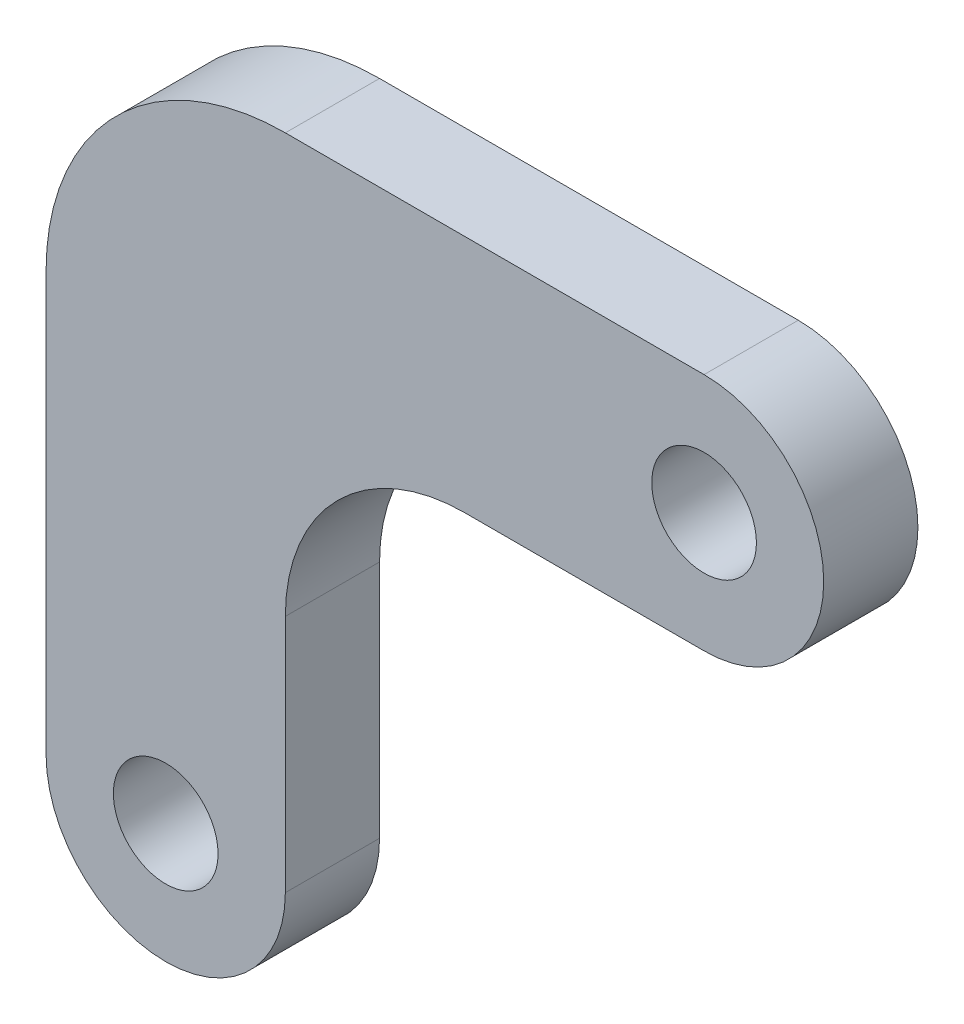
ISO-10303-21;
HEADER;
FILE_DESCRIPTION(('STEP AP214'),'2;1');
FILE_NAME('part.step','',(''),(''),'','','');
FILE_SCHEMA(('AUTOMOTIVE_DESIGN { 1 0 10303 214 1 1 1 1 }'));
ENDSEC;
DATA;
#1=APPLICATION_CONTEXT('core data for automotive mechanical design processes');
#2=APPLICATION_PROTOCOL_DEFINITION('international standard','automotive_design',2000,#1);
#3=PRODUCT_CONTEXT('',#1,'mechanical');
#4=PRODUCT('Part','Part','',(#3));
#5=PRODUCT_RELATED_PRODUCT_CATEGORY('part','',(#4));
#6=PRODUCT_DEFINITION_FORMATION('','',#4);
#7=PRODUCT_DEFINITION_CONTEXT('part definition',#1,'design');
#8=PRODUCT_DEFINITION('design','',#6,#7);
#9=PRODUCT_DEFINITION_SHAPE('','',#8);
#10=(LENGTH_UNIT() NAMED_UNIT(*) SI_UNIT(.MILLI.,.METRE.));
#11=(NAMED_UNIT(*) PLANE_ANGLE_UNIT() SI_UNIT($,.RADIAN.));
#12=(NAMED_UNIT(*) SI_UNIT($,.STERADIAN.) SOLID_ANGLE_UNIT());
#13=UNCERTAINTY_MEASURE_WITH_UNIT(LENGTH_MEASURE(1.E-05),#10,'distance_accuracy_value','');
#14=(GEOMETRIC_REPRESENTATION_CONTEXT(3) GLOBAL_UNCERTAINTY_ASSIGNED_CONTEXT((#13)) GLOBAL_UNIT_ASSIGNED_CONTEXT((#10,
#11,#12)) REPRESENTATION_CONTEXT('',''));
#15=CARTESIAN_POINT('',(0.,0.,0.));
#16=DIRECTION('',(0.,0.,1.));
#17=DIRECTION('',(1.,0.,0.));
#18=AXIS2_PLACEMENT_3D('',#15,#16,#17);
#19=CARTESIAN_POINT('',(12.7,44.45,10.));
#20=DIRECTION('',(0.,0.,-1.));
#21=DIRECTION('',(-1.,0.,0.));
#22=AXIS2_PLACEMENT_3D('',#19,#20,#21);
#23=CYLINDRICAL_SURFACE('',#22,25.4);
#24=CARTESIAN_POINT('',(12.7,44.45,0.));
#25=DIRECTION('',(0.,0.,1.));
#26=DIRECTION('',(1.,0.,0.));
#27=AXIS2_PLACEMENT_3D('',#24,#25,#26);
#28=CIRCLE('',#27,25.4);
#29=CARTESIAN_POINT('',(-12.7,44.45,0.));
#30=VERTEX_POINT('',#29);
#31=CARTESIAN_POINT('',(12.7,69.85,0.));
#32=VERTEX_POINT('',#31);
#33=EDGE_CURVE('E136',#30,#32,#28,.F.);
#34=ORIENTED_EDGE('',*,*,#33,.F.);
#35=DIRECTION('',(0.,0.,-1.));
#36=VECTOR('',#35,1.);
#37=CARTESIAN_POINT('',(-12.7,44.45,10.));
#38=LINE('',#37,#36);
#39=CARTESIAN_POINT('',(-12.7,44.45,10.));
#40=VERTEX_POINT('',#39);
#41=EDGE_CURVE('E11',#40,#30,#38,.T.);
#42=ORIENTED_EDGE('',*,*,#41,.F.);
#43=CARTESIAN_POINT('',(12.7,44.45,10.));
#44=DIRECTION('',(0.,0.,1.));
#45=DIRECTION('',(1.,0.,0.));
#46=AXIS2_PLACEMENT_3D('',#43,#44,#45);
#47=CIRCLE('',#46,25.4);
#48=CARTESIAN_POINT('',(12.7,69.85,10.));
#49=VERTEX_POINT('',#48);
#50=EDGE_CURVE('E160',#40,#49,#47,.F.);
#51=ORIENTED_EDGE('',*,*,#50,.T.);
#52=DIRECTION('',(0.,0.,-1.));
#53=VECTOR('',#52,1.);
#54=CARTESIAN_POINT('',(12.7,69.85,10.));
#55=LINE('',#54,#53);
#56=EDGE_CURVE('E50',#49,#32,#55,.T.);
#57=ORIENTED_EDGE('',*,*,#56,.T.);
#58=EDGE_LOOP('',(#34,#42,#51,#57));
#59=FACE_BOUND('',#58,.T.);
#60=ADVANCED_FACE('F34',(#59),#23,.T.);
#61=CARTESIAN_POINT('',(-12.7,0.,10.));
#62=DIRECTION('',(1.,0.,0.));
#63=DIRECTION('',(0.,1.,0.));
#64=AXIS2_PLACEMENT_3D('',#61,#62,#63);
#65=PLANE('',#64);
#66=DIRECTION('',(0.,-1.,0.));
#67=VECTOR('',#66,1.);
#68=CARTESIAN_POINT('',(-12.7,0.,0.));
#69=LINE('',#68,#67);
#70=CARTESIAN_POINT('',(-12.7,0.,0.));
#71=VERTEX_POINT('',#70);
#72=EDGE_CURVE('E138',#30,#71,#69,.T.);
#73=ORIENTED_EDGE('',*,*,#72,.T.);
#74=DIRECTION('',(0.,0.,-1.));
#75=VECTOR('',#74,1.);
#76=CARTESIAN_POINT('',(-12.7,0.,10.));
#77=LINE('',#76,#75);
#78=CARTESIAN_POINT('',(-12.7,0.,10.));
#79=VERTEX_POINT('',#78);
#80=EDGE_CURVE('E42',#79,#71,#77,.T.);
#81=ORIENTED_EDGE('',*,*,#80,.F.);
#82=DIRECTION('',(0.,-1.,0.));
#83=VECTOR('',#82,1.);
#84=CARTESIAN_POINT('',(-12.7,0.,10.));
#85=LINE('',#84,#83);
#86=EDGE_CURVE('E187',#40,#79,#85,.T.);
#87=ORIENTED_EDGE('',*,*,#86,.F.);
#88=ORIENTED_EDGE('',*,*,#41,.T.);
#89=EDGE_LOOP('',(#73,#81,#87,#88));
#90=FACE_BOUND('',#89,.T.);
#91=ADVANCED_FACE('F206',(#90),#65,.F.);
#92=CARTESIAN_POINT('',(0.,0.,10.));
#93=DIRECTION('',(0.,0.,-1.));
#94=DIRECTION('',(-1.,0.,0.));
#95=AXIS2_PLACEMENT_3D('',#92,#93,#94);
#96=CYLINDRICAL_SURFACE('',#95,12.7);
#97=CARTESIAN_POINT('',(0.,0.,0.));
#98=DIRECTION('',(0.,0.,1.));
#99=DIRECTION('',(1.,0.,0.));
#100=AXIS2_PLACEMENT_3D('',#97,#98,#99);
#101=CIRCLE('',#100,12.7);
#102=CARTESIAN_POINT('',(12.7,0.,0.));
#103=VERTEX_POINT('',#102);
#104=EDGE_CURVE('E140',#71,#103,#101,.T.);
#105=ORIENTED_EDGE('',*,*,#104,.T.);
#106=DIRECTION('',(0.,0.,-1.));
#107=VECTOR('',#106,1.);
#108=CARTESIAN_POINT('',(12.7,0.,10.));
#109=LINE('',#108,#107);
#110=CARTESIAN_POINT('',(12.7,0.,10.));
#111=VERTEX_POINT('',#110);
#112=EDGE_CURVE('E166',#111,#103,#109,.T.);
#113=ORIENTED_EDGE('',*,*,#112,.F.);
#114=CARTESIAN_POINT('',(0.,0.,10.));
#115=DIRECTION('',(0.,0.,1.));
#116=DIRECTION('',(1.,0.,0.));
#117=AXIS2_PLACEMENT_3D('',#114,#115,#116);
#118=CIRCLE('',#117,12.7);
#119=EDGE_CURVE('E174',#79,#111,#118,.T.);
#120=ORIENTED_EDGE('',*,*,#119,.F.);
#121=ORIENTED_EDGE('',*,*,#80,.T.);
#122=EDGE_LOOP('',(#105,#113,#120,#121));
#123=FACE_BOUND('',#122,.T.);
#124=ADVANCED_FACE('F172',(#123),#96,.T.);
#125=CARTESIAN_POINT('',(12.7,0.,10.));
#126=DIRECTION('',(1.,0.,0.));
#127=DIRECTION('',(0.,1.,0.));
#128=AXIS2_PLACEMENT_3D('',#125,#126,#127);
#129=PLANE('',#128);
#130=DIRECTION('',(0.,-1.,0.));
#131=VECTOR('',#130,1.);
#132=CARTESIAN_POINT('',(12.7,0.,0.));
#133=LINE('',#132,#131);
#134=CARTESIAN_POINT('',(12.7,25.4,0.));
#135=VERTEX_POINT('',#134);
#136=EDGE_CURVE('E143',#135,#103,#133,.T.);
#137=ORIENTED_EDGE('',*,*,#136,.F.);
#138=DIRECTION('',(0.,0.,-1.));
#139=VECTOR('',#138,1.);
#140=CARTESIAN_POINT('',(12.7,25.4,10.));
#141=LINE('',#140,#139);
#142=CARTESIAN_POINT('',(12.7,25.4,10.));
#143=VERTEX_POINT('',#142);
#144=EDGE_CURVE('E164',#143,#135,#141,.T.);
#145=ORIENTED_EDGE('',*,*,#144,.F.);
#146=DIRECTION('',(0.,-1.,0.));
#147=VECTOR('',#146,1.);
#148=CARTESIAN_POINT('',(12.7,0.,10.));
#149=LINE('',#148,#147);
#150=EDGE_CURVE('E185',#143,#111,#149,.T.);
#151=ORIENTED_EDGE('',*,*,#150,.T.);
#152=ORIENTED_EDGE('',*,*,#112,.T.);
#153=EDGE_LOOP('',(#137,#145,#151,#152));
#154=FACE_BOUND('',#153,.T.);
#155=ADVANCED_FACE('F183',(#154),#129,.T.);
#156=CARTESIAN_POINT('',(31.75,25.4,10.));
#157=DIRECTION('',(0.,0.,-1.));
#158=DIRECTION('',(-1.,0.,0.));
#159=AXIS2_PLACEMENT_3D('',#156,#157,#158);
#160=CYLINDRICAL_SURFACE('',#159,19.05);
#161=CARTESIAN_POINT('',(31.75,25.4,0.));
#162=DIRECTION('',(0.,0.,1.));
#163=DIRECTION('',(1.,0.,0.));
#164=AXIS2_PLACEMENT_3D('',#161,#162,#163);
#165=CIRCLE('',#164,19.05);
#166=CARTESIAN_POINT('',(31.75,44.45,0.));
#167=VERTEX_POINT('',#166);
#168=EDGE_CURVE('E146',#135,#167,#165,.F.);
#169=ORIENTED_EDGE('',*,*,#168,.T.);
#170=DIRECTION('',(0.,0.,-1.));
#171=VECTOR('',#170,1.);
#172=CARTESIAN_POINT('',(31.75,44.45,10.));
#173=LINE('',#172,#171);
#174=CARTESIAN_POINT('',(31.75,44.45,10.));
#175=VERTEX_POINT('',#174);
#176=EDGE_CURVE('E122',#175,#167,#173,.T.);
#177=ORIENTED_EDGE('',*,*,#176,.F.);
#178=CARTESIAN_POINT('',(31.75,25.4,10.));
#179=DIRECTION('',(0.,0.,1.));
#180=DIRECTION('',(1.,0.,0.));
#181=AXIS2_PLACEMENT_3D('',#178,#179,#180);
#182=CIRCLE('',#181,19.05);
#183=EDGE_CURVE('E110',#143,#175,#182,.F.);
#184=ORIENTED_EDGE('',*,*,#183,.F.);
#185=ORIENTED_EDGE('',*,*,#144,.T.);
#186=EDGE_LOOP('',(#169,#177,#184,#185));
#187=FACE_BOUND('',#186,.T.);
#188=ADVANCED_FACE('F217',(#187),#160,.F.);
#189=CARTESIAN_POINT('',(0.,44.45,10.));
#190=DIRECTION('',(0.,1.,0.));
#191=DIRECTION('',(0.,0.,1.));
#192=AXIS2_PLACEMENT_3D('',#189,#190,#191);
#193=PLANE('',#192);
#194=DIRECTION('',(1.,0.,0.));
#195=VECTOR('',#194,1.);
#196=CARTESIAN_POINT('',(0.,44.45,0.));
#197=LINE('',#196,#195);
#198=CARTESIAN_POINT('',(57.15,44.45,0.));
#199=VERTEX_POINT('',#198);
#200=EDGE_CURVE('E119',#167,#199,#197,.T.);
#201=ORIENTED_EDGE('',*,*,#200,.T.);
#202=DIRECTION('',(0.,0.,-1.));
#203=VECTOR('',#202,1.);
#204=CARTESIAN_POINT('',(57.15,44.45,10.));
#205=LINE('',#204,#203);
#206=CARTESIAN_POINT('',(57.15,44.45,10.));
#207=VERTEX_POINT('',#206);
#208=EDGE_CURVE('E116',#207,#199,#205,.T.);
#209=ORIENTED_EDGE('',*,*,#208,.F.);
#210=DIRECTION('',(1.,0.,0.));
#211=VECTOR('',#210,1.);
#212=CARTESIAN_POINT('',(0.,44.45,10.));
#213=LINE('',#212,#211);
#214=EDGE_CURVE('E100',#175,#207,#213,.T.);
#215=ORIENTED_EDGE('',*,*,#214,.F.);
#216=ORIENTED_EDGE('',*,*,#176,.T.);
#217=EDGE_LOOP('',(#201,#209,#215,#216));
#218=FACE_BOUND('',#217,.T.);
#219=ADVANCED_FACE('F117',(#218),#193,.F.);
#220=CARTESIAN_POINT('',(57.15,57.15,10.));
#221=DIRECTION('',(0.,0.,-1.));
#222=DIRECTION('',(-1.,0.,0.));
#223=AXIS2_PLACEMENT_3D('',#220,#221,#222);
#224=CYLINDRICAL_SURFACE('',#223,12.7);
#225=CARTESIAN_POINT('',(57.15,57.15,0.));
#226=DIRECTION('',(0.,0.,1.));
#227=DIRECTION('',(1.,0.,0.));
#228=AXIS2_PLACEMENT_3D('',#225,#226,#227);
#229=CIRCLE('',#228,12.7);
#230=CARTESIAN_POINT('',(57.15,69.85,0.));
#231=VERTEX_POINT('',#230);
#232=EDGE_CURVE('E149',#199,#231,#229,.T.);
#233=ORIENTED_EDGE('',*,*,#232,.T.);
#234=DIRECTION('',(0.,0.,-1.));
#235=VECTOR('',#234,1.);
#236=CARTESIAN_POINT('',(57.15,69.85,10.));
#237=LINE('',#236,#235);
#238=CARTESIAN_POINT('',(57.15,69.85,10.));
#239=VERTEX_POINT('',#238);
#240=EDGE_CURVE('E76',#239,#231,#237,.T.);
#241=ORIENTED_EDGE('',*,*,#240,.F.);
#242=CARTESIAN_POINT('',(57.15,57.15,10.));
#243=DIRECTION('',(0.,0.,1.));
#244=DIRECTION('',(1.,0.,0.));
#245=AXIS2_PLACEMENT_3D('',#242,#243,#244);
#246=CIRCLE('',#245,12.7);
#247=EDGE_CURVE('E107',#207,#239,#246,.T.);
#248=ORIENTED_EDGE('',*,*,#247,.F.);
#249=ORIENTED_EDGE('',*,*,#208,.T.);
#250=EDGE_LOOP('',(#233,#241,#248,#249));
#251=FACE_BOUND('',#250,.T.);
#252=ADVANCED_FACE('F124',(#251),#224,.T.);
#253=CARTESIAN_POINT('',(57.15,57.15,10.));
#254=DIRECTION('',(0.,0.,-1.));
#255=DIRECTION('',(-1.,0.,0.));
#256=AXIS2_PLACEMENT_3D('',#253,#254,#255);
#257=CYLINDRICAL_SURFACE('',#256,5.55625);
#258=CARTESIAN_POINT('',(57.15,57.15,10.));
#259=DIRECTION('',(0.,0.,1.));
#260=DIRECTION('',(1.,0.,0.));
#261=AXIS2_PLACEMENT_3D('',#258,#259,#260);
#262=CIRCLE('',#261,5.55625);
#263=CARTESIAN_POINT('',(62.70625,57.15,10.));
#264=VERTEX_POINT('',#263);
#265=EDGE_CURVE('E127',#264,#264,#262,.T.);
#266=ORIENTED_EDGE('',*,*,#265,.T.);
#267=EDGE_LOOP('',(#266));
#268=FACE_BOUND('',#267,.T.);
#269=CARTESIAN_POINT('',(57.15,57.15,0.));
#270=DIRECTION('',(0.,0.,1.));
#271=DIRECTION('',(1.,0.,0.));
#272=AXIS2_PLACEMENT_3D('',#269,#270,#271);
#273=CIRCLE('',#272,5.55625);
#274=CARTESIAN_POINT('',(62.70625,57.15,0.));
#275=VERTEX_POINT('',#274);
#276=EDGE_CURVE('E154',#275,#275,#273,.T.);
#277=ORIENTED_EDGE('',*,*,#276,.F.);
#278=EDGE_LOOP('',(#277));
#279=FACE_BOUND('',#278,.T.);
#280=ADVANCED_FACE('F194',(#268,#279),#257,.F.);
#281=CARTESIAN_POINT('',(0.,69.85,10.));
#282=DIRECTION('',(0.,1.,0.));
#283=DIRECTION('',(0.,0.,1.));
#284=AXIS2_PLACEMENT_3D('',#281,#282,#283);
#285=PLANE('',#284);
#286=DIRECTION('',(1.,0.,0.));
#287=VECTOR('',#286,1.);
#288=CARTESIAN_POINT('',(0.,69.85,0.));
#289=LINE('',#288,#287);
#290=EDGE_CURVE('E151',#32,#231,#289,.T.);
#291=ORIENTED_EDGE('',*,*,#290,.F.);
#292=ORIENTED_EDGE('',*,*,#56,.F.);
#293=DIRECTION('',(1.,0.,0.));
#294=VECTOR('',#293,1.);
#295=CARTESIAN_POINT('',(0.,69.85,10.));
#296=LINE('',#295,#294);
#297=EDGE_CURVE('E125',#49,#239,#296,.T.);
#298=ORIENTED_EDGE('',*,*,#297,.T.);
#299=ORIENTED_EDGE('',*,*,#240,.T.);
#300=EDGE_LOOP('',(#291,#292,#298,#299));
#301=FACE_BOUND('',#300,.T.);
#302=ADVANCED_FACE('F191',(#301),#285,.T.);
#303=CARTESIAN_POINT('',(0.,0.,10.));
#304=DIRECTION('',(0.,0.,-1.));
#305=DIRECTION('',(-1.,0.,0.));
#306=AXIS2_PLACEMENT_3D('',#303,#304,#305);
#307=CYLINDRICAL_SURFACE('',#306,5.55625);
#308=CARTESIAN_POINT('',(0.,0.,10.));
#309=DIRECTION('',(0.,0.,1.));
#310=DIRECTION('',(1.,0.,0.));
#311=AXIS2_PLACEMENT_3D('',#308,#309,#310);
#312=CIRCLE('',#311,5.55625);
#313=CARTESIAN_POINT('',(5.55625,0.,10.));
#314=VERTEX_POINT('',#313);
#315=EDGE_CURVE('E133',#314,#314,#312,.T.);
#316=ORIENTED_EDGE('',*,*,#315,.T.);
#317=EDGE_LOOP('',(#316));
#318=FACE_BOUND('',#317,.T.);
#319=CARTESIAN_POINT('',(0.,0.,0.));
#320=DIRECTION('',(0.,0.,1.));
#321=DIRECTION('',(1.,0.,0.));
#322=AXIS2_PLACEMENT_3D('',#319,#320,#321);
#323=CIRCLE('',#322,5.55625);
#324=CARTESIAN_POINT('',(5.55625,0.,0.));
#325=VERTEX_POINT('',#324);
#326=EDGE_CURVE('E157',#325,#325,#323,.T.);
#327=ORIENTED_EDGE('',*,*,#326,.F.);
#328=EDGE_LOOP('',(#327));
#329=FACE_BOUND('',#328,.T.);
#330=ADVANCED_FACE('F193',(#318,#329),#307,.F.);
#331=CARTESIAN_POINT('',(0.,0.,10.));
#332=DIRECTION('',(0.,0.,1.));
#333=DIRECTION('',(1.,0.,0.));
#334=AXIS2_PLACEMENT_3D('',#331,#332,#333);
#335=PLANE('',#334);
#336=ORIENTED_EDGE('',*,*,#50,.F.);
#337=ORIENTED_EDGE('',*,*,#86,.T.);
#338=ORIENTED_EDGE('',*,*,#119,.T.);
#339=ORIENTED_EDGE('',*,*,#150,.F.);
#340=ORIENTED_EDGE('',*,*,#183,.T.);
#341=ORIENTED_EDGE('',*,*,#214,.T.);
#342=ORIENTED_EDGE('',*,*,#247,.T.);
#343=ORIENTED_EDGE('',*,*,#297,.F.);
#344=EDGE_LOOP('',(#336,#337,#338,#339,#340,#341,#342,#343));
#345=FACE_BOUND('',#344,.T.);
#346=ORIENTED_EDGE('',*,*,#265,.F.);
#347=EDGE_LOOP('',(#346));
#348=FACE_BOUND('',#347,.T.);
#349=ORIENTED_EDGE('',*,*,#315,.F.);
#350=EDGE_LOOP('',(#349));
#351=FACE_BOUND('',#350,.T.);
#352=ADVANCED_FACE('F103',(#345,#348,#351),#335,.T.);
#353=CARTESIAN_POINT('',(0.,0.,0.));
#354=DIRECTION('',(0.,0.,1.));
#355=DIRECTION('',(1.,0.,0.));
#356=AXIS2_PLACEMENT_3D('',#353,#354,#355);
#357=PLANE('',#356);
#358=ORIENTED_EDGE('',*,*,#33,.T.);
#359=ORIENTED_EDGE('',*,*,#290,.T.);
#360=ORIENTED_EDGE('',*,*,#232,.F.);
#361=ORIENTED_EDGE('',*,*,#200,.F.);
#362=ORIENTED_EDGE('',*,*,#168,.F.);
#363=ORIENTED_EDGE('',*,*,#136,.T.);
#364=ORIENTED_EDGE('',*,*,#104,.F.);
#365=ORIENTED_EDGE('',*,*,#72,.F.);
#366=EDGE_LOOP('',(#358,#359,#360,#361,#362,#363,#364,#365));
#367=FACE_BOUND('',#366,.T.);
#368=ORIENTED_EDGE('',*,*,#276,.T.);
#369=EDGE_LOOP('',(#368));
#370=FACE_BOUND('',#369,.T.);
#371=ORIENTED_EDGE('',*,*,#326,.T.);
#372=EDGE_LOOP('',(#371));
#373=FACE_BOUND('',#372,.T.);
#374=ADVANCED_FACE('F178',(#367,#370,#373),#357,.F.);
#375=CLOSED_SHELL('',(#60,#91,#124,#155,#188,#219,#252,#280,#302,#330,#352,#374));
#376=MANIFOLD_SOLID_BREP('B2',#375);
#377=ADVANCED_BREP_SHAPE_REPRESENTATION('',(#18,#376),#14);
#378=SHAPE_DEFINITION_REPRESENTATION(#9,#377);
ENDSEC;
END-ISO-10303-21;
